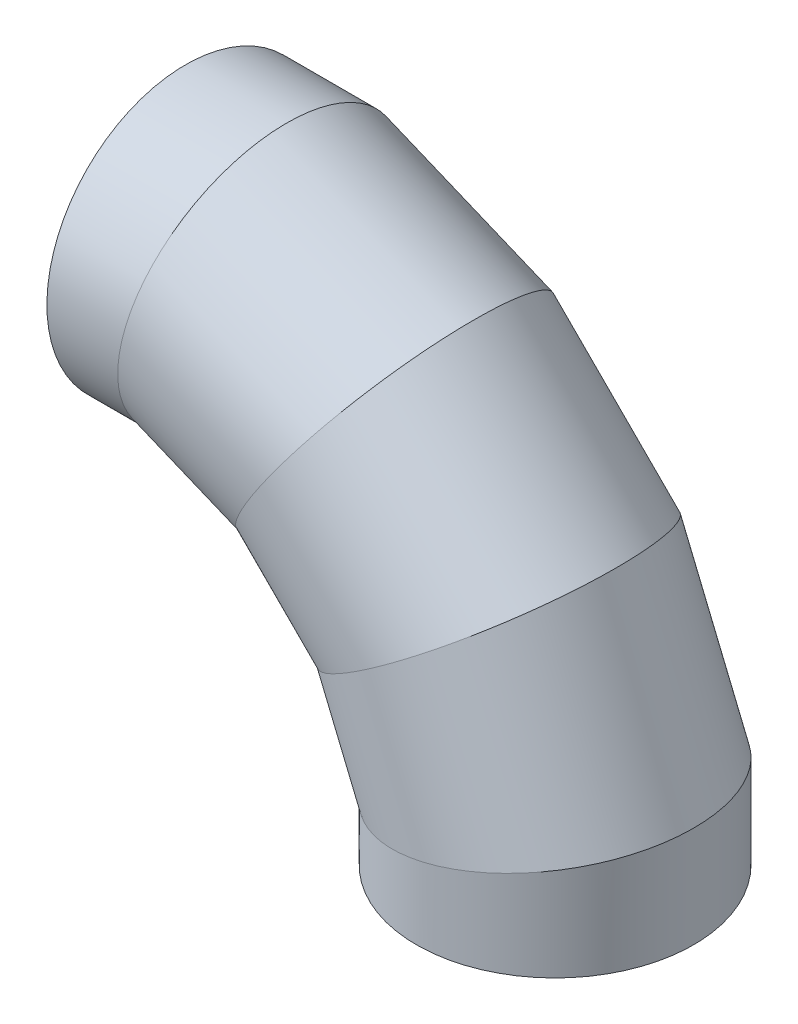
ISO-10303-21;
HEADER;
FILE_DESCRIPTION(('STEP AP214'),'2;1');
FILE_NAME('part.step','',(''),(''),'','','');
FILE_SCHEMA(('AUTOMOTIVE_DESIGN { 1 0 10303 214 1 1 1 1 }'));
ENDSEC;
DATA;
#1=APPLICATION_CONTEXT('core data for automotive mechanical design processes');
#2=APPLICATION_PROTOCOL_DEFINITION('international standard','automotive_design',2000,#1);
#3=PRODUCT_CONTEXT('',#1,'mechanical');
#4=PRODUCT('Part','Part','',(#3));
#5=PRODUCT_RELATED_PRODUCT_CATEGORY('part','',(#4));
#6=PRODUCT_DEFINITION_FORMATION('','',#4);
#7=PRODUCT_DEFINITION_CONTEXT('part definition',#1,'design');
#8=PRODUCT_DEFINITION('design','',#6,#7);
#9=PRODUCT_DEFINITION_SHAPE('','',#8);
#10=(LENGTH_UNIT() NAMED_UNIT(*) SI_UNIT(.MILLI.,.METRE.));
#11=(NAMED_UNIT(*) PLANE_ANGLE_UNIT() SI_UNIT($,.RADIAN.));
#12=(NAMED_UNIT(*) SI_UNIT($,.STERADIAN.) SOLID_ANGLE_UNIT());
#13=UNCERTAINTY_MEASURE_WITH_UNIT(LENGTH_MEASURE(1.E-05),#10,'distance_accuracy_value','');
#14=(GEOMETRIC_REPRESENTATION_CONTEXT(3) GLOBAL_UNCERTAINTY_ASSIGNED_CONTEXT((#13)) GLOBAL_UNIT_ASSIGNED_CONTEXT((#10,
#11,#12)) REPRESENTATION_CONTEXT('',''));
#15=CARTESIAN_POINT('',(0.,0.,0.));
#16=DIRECTION('',(0.,0.,1.));
#17=DIRECTION('',(1.,0.,0.));
#18=AXIS2_PLACEMENT_3D('',#15,#16,#17);
#19=CARTESIAN_POINT('',(280.14424979064,419.265498614272,-375.01));
#20=DIRECTION('',(0.831469612302545,-0.555570233019602,0.));
#21=DIRECTION('',(0.555570233019602,0.831469612302545,0.));
#22=AXIS2_PLACEMENT_3D('',#19,#20,#21);
#23=PLANE('',#22);
#24=CARTESIAN_POINT('',(566.454497350522,847.759065022574,0.));
#25=DIRECTION('',(0.831469612302545,-0.555570233019602,0.));
#26=DIRECTION('',(0.555570233019602,0.831469612302545,0.));
#27=AXIS2_PLACEMENT_3D('',#24,#25,#26);
#28=ELLIPSE('',#27,382.34668432812,375.);
#29=CARTESIAN_POINT('',(354.035760214366,529.851958926477,-1.5));
#30=VERTEX_POINT('',#29);
#31=CARTESIAN_POINT('',(354.035760214366,529.851958926477,1.5));
#32=VERTEX_POINT('',#31);
#33=EDGE_CURVE('E137',#30,#32,#28,.T.);
#34=ORIENTED_EDGE('',*,*,#33,.F.);
#35=DIRECTION('',(0.555570233019602,0.831469612302545,0.));
#36=VECTOR('',#35,1.);
#37=CARTESIAN_POINT('',(0.,0.,-1.5));
#38=LINE('',#37,#36);
#39=CARTESIAN_POINT('',(358.567433236969,536.634086886623,-1.5));
#40=VERTEX_POINT('',#39);
#41=EDGE_CURVE('E103',#30,#40,#38,.T.);
#42=ORIENTED_EDGE('',*,*,#41,.T.);
#43=CARTESIAN_POINT('',(566.454497350521,847.759065022575,0.));
#44=DIRECTION('',(0.831469612302545,-0.555570233019602,0.));
#45=DIRECTION('',(-0.555570233019602,-0.831469612302545,0.));
#46=AXIS2_PLACEMENT_3D('',#43,#44,#45);
#47=ELLIPSE('',#46,374.189955062453,367.);
#48=CARTESIAN_POINT('',(358.567433236969,536.634086886623,1.5));
#49=VERTEX_POINT('',#48);
#50=EDGE_CURVE('E102',#40,#49,#47,.T.);
#51=ORIENTED_EDGE('',*,*,#50,.T.);
#52=DIRECTION('',(0.555570233019602,0.831469612302545,0.));
#53=VECTOR('',#52,1.);
#54=CARTESIAN_POINT('',(0.,0.,1.5));
#55=LINE('',#54,#53);
#56=EDGE_CURVE('E78',#32,#49,#55,.T.);
#57=ORIENTED_EDGE('',*,*,#56,.F.);
#58=EDGE_LOOP('',(#34,#42,#51,#57));
#59=FACE_BOUND('',#58,.T.);
#60=ADVANCED_FACE('F53',(#59),#23,.F.);
#61=CARTESIAN_POINT('',(419.265498614272,280.14424979064,-375.01));
#62=DIRECTION('',(0.555570233019602,-0.831469612302545,0.));
#63=DIRECTION('',(0.831469612302545,0.555570233019602,0.));
#64=AXIS2_PLACEMENT_3D('',#61,#62,#63);
#65=PLANE('',#64);
#66=CARTESIAN_POINT('',(847.759065022574,566.454497350522,0.));
#67=DIRECTION('',(0.555570233019602,-0.831469612302546,0.));
#68=DIRECTION('',(0.831469612302546,0.555570233019602,0.));
#69=AXIS2_PLACEMENT_3D('',#66,#67,#68);
#70=ELLIPSE('',#69,382.346684328119,375.);
#71=CARTESIAN_POINT('',(529.851958926477,354.035760214366,-1.5));
#72=VERTEX_POINT('',#71);
#73=CARTESIAN_POINT('',(529.851958926477,354.035760214366,1.5));
#74=VERTEX_POINT('',#73);
#75=EDGE_CURVE('E57',#72,#74,#70,.T.);
#76=ORIENTED_EDGE('',*,*,#75,.T.);
#77=DIRECTION('',(0.831469612302545,0.555570233019602,0.));
#78=VECTOR('',#77,1.);
#79=CARTESIAN_POINT('',(0.,0.,1.5));
#80=LINE('',#79,#78);
#81=CARTESIAN_POINT('',(536.634086886622,358.56743323697,1.5));
#82=VERTEX_POINT('',#81);
#83=EDGE_CURVE('E99',#74,#82,#80,.T.);
#84=ORIENTED_EDGE('',*,*,#83,.T.);
#85=CARTESIAN_POINT('',(847.759065022573,566.454497350522,0.));
#86=DIRECTION('',(0.555570233019602,-0.831469612302545,0.));
#87=DIRECTION('',(-0.831469612302545,-0.555570233019602,0.));
#88=AXIS2_PLACEMENT_3D('',#85,#86,#87);
#89=ELLIPSE('',#88,374.189955062453,367.);
#90=CARTESIAN_POINT('',(536.634086886622,358.56743323697,-1.5));
#91=VERTEX_POINT('',#90);
#92=EDGE_CURVE('E70',#91,#82,#89,.T.);
#93=ORIENTED_EDGE('',*,*,#92,.F.);
#94=DIRECTION('',(0.831469612302545,0.555570233019602,0.));
#95=VECTOR('',#94,1.);
#96=CARTESIAN_POINT('',(0.,0.,-1.5));
#97=LINE('',#96,#95);
#98=EDGE_CURVE('E98',#72,#91,#97,.T.);
#99=ORIENTED_EDGE('',*,*,#98,.F.);
#100=EDGE_LOOP('',(#76,#84,#93,#99));
#101=FACE_BOUND('',#100,.T.);
#102=ADVANCED_FACE('F109',(#101),#65,.T.);
#103=CARTESIAN_POINT('',(450.345652507681,963.867909865415,0.));
#104=DIRECTION('',(0.707106781186547,-0.707106781186548,0.));
#105=DIRECTION('',(0.707106781186548,0.707106781186547,0.));
#106=AXIS2_PLACEMENT_3D('',#103,#104,#105);
#107=CYLINDRICAL_SURFACE('',#106,367.);
#108=ORIENTED_EDGE('',*,*,#50,.F.);
#109=DIRECTION('',(0.707106781186547,-0.707106781186548,0.));
#110=VECTOR('',#109,1.);
#111=CARTESIAN_POINT('',(190.839631382929,704.361888740663,-1.5));
#112=LINE('',#111,#110);
#113=EDGE_CURVE('E134',#40,#91,#112,.T.);
#114=ORIENTED_EDGE('',*,*,#113,.T.);
#115=ORIENTED_EDGE('',*,*,#92,.T.);
#116=DIRECTION('',(0.707106781186547,-0.707106781186548,0.));
#117=VECTOR('',#116,1.);
#118=CARTESIAN_POINT('',(190.839631382929,704.361888740663,1.5));
#119=LINE('',#118,#117);
#120=EDGE_CURVE('E12',#49,#82,#119,.T.);
#121=ORIENTED_EDGE('',*,*,#120,.F.);
#122=EDGE_LOOP('',(#108,#114,#115,#121));
#123=FACE_BOUND('',#122,.T.);
#124=ADVANCED_FACE('F106',(#123),#107,.F.);
#125=CARTESIAN_POINT('',(450.345652507681,963.867909865415,0.));
#126=DIRECTION('',(0.707106781186547,-0.707106781186548,0.));
#127=DIRECTION('',(0.707106781186548,0.707106781186547,0.));
#128=AXIS2_PLACEMENT_3D('',#125,#126,#127);
#129=CYLINDRICAL_SURFACE('',#128,375.);
#130=DIRECTION('',(0.707106781186547,-0.707106781186548,0.));
#131=VECTOR('',#130,1.);
#132=CARTESIAN_POINT('',(185.182730891555,698.704988249288,-1.5));
#133=LINE('',#132,#131);
#134=EDGE_CURVE('E131',#30,#72,#133,.T.);
#135=ORIENTED_EDGE('',*,*,#134,.F.);
#136=ORIENTED_EDGE('',*,*,#33,.T.);
#137=DIRECTION('',(0.707106781186547,-0.707106781186548,0.));
#138=VECTOR('',#137,1.);
#139=CARTESIAN_POINT('',(185.182730891555,698.704988249288,1.5));
#140=LINE('',#139,#138);
#141=EDGE_CURVE('E62',#32,#74,#140,.T.);
#142=ORIENTED_EDGE('',*,*,#141,.T.);
#143=ORIENTED_EDGE('',*,*,#75,.F.);
#144=EDGE_LOOP('',(#135,#136,#142,#143));
#145=FACE_BOUND('',#144,.T.);
#146=ADVANCED_FACE('F108',(#145),#129,.T.);
#147=CARTESIAN_POINT('',(0.,0.,-1.5));
#148=DIRECTION('',(0.,0.,1.));
#149=DIRECTION('',(1.,0.,0.));
#150=AXIS2_PLACEMENT_3D('',#147,#148,#149);
#151=PLANE('',#150);
#152=ORIENTED_EDGE('',*,*,#134,.T.);
#153=ORIENTED_EDGE('',*,*,#98,.T.);
#154=ORIENTED_EDGE('',*,*,#113,.F.);
#155=ORIENTED_EDGE('',*,*,#41,.F.);
#156=EDGE_LOOP('',(#152,#153,#154,#155));
#157=FACE_BOUND('',#156,.T.);
#158=ADVANCED_FACE('F115',(#157),#151,.T.);
#159=CARTESIAN_POINT('',(0.,0.,1.5));
#160=DIRECTION('',(0.,0.,1.));
#161=DIRECTION('',(1.,0.,0.));
#162=AXIS2_PLACEMENT_3D('',#159,#160,#161);
#163=PLANE('',#162);
#164=ORIENTED_EDGE('',*,*,#83,.F.);
#165=ORIENTED_EDGE('',*,*,#141,.F.);
#166=ORIENTED_EDGE('',*,*,#56,.T.);
#167=ORIENTED_EDGE('',*,*,#120,.T.);
#168=EDGE_LOOP('',(#164,#165,#166,#167));
#169=FACE_BOUND('',#168,.T.);
#170=ADVANCED_FACE('F55',(#169),#163,.F.);
#171=CLOSED_SHELL('',(#60,#102,#124,#146,#158,#170));
#172=MANIFOLD_SOLID_BREP('B2',#171);
#173=CARTESIAN_POINT('',(98.3735784503311,494.55737592509,-375.01));
#174=DIRECTION('',(0.98078528040323,-0.195090322016128,0.));
#175=DIRECTION('',(0.195090322016128,0.980785280403231,0.));
#176=AXIS2_PLACEMENT_3D('',#173,#174,#175);
#177=PLANE('',#176);
#178=CARTESIAN_POINT('',(198.912367379658,1000.,0.));
#179=DIRECTION('',(0.98078528040323,-0.195090322016128,0.));
#180=DIRECTION('',(0.195090322016128,0.980785280403231,0.));
#181=AXIS2_PLACEMENT_3D('',#178,#179,#180);
#182=ELLIPSE('',#181,382.346684328119,375.);
#183=CARTESIAN_POINT('',(124.320826351775,625.003000012,-1.5));
#184=VERTEX_POINT('',#183);
#185=CARTESIAN_POINT('',(124.320826351775,625.003000012,1.5));
#186=VERTEX_POINT('',#185);
#187=EDGE_CURVE('E198',#184,#186,#182,.T.);
#188=ORIENTED_EDGE('',*,*,#187,.T.);
#189=DIRECTION('',(0.195090322016128,0.980785280403231,0.));
#190=VECTOR('',#189,1.);
#191=CARTESIAN_POINT('',(0.,0.,1.5));
#192=LINE('',#191,#190);
#193=CARTESIAN_POINT('',(125.912138298865,633.003065407898,1.5));
#194=VERTEX_POINT('',#193);
#195=EDGE_CURVE('E244',#186,#194,#192,.T.);
#196=ORIENTED_EDGE('',*,*,#195,.T.);
#197=CARTESIAN_POINT('',(198.912367379658,1000.,0.));
#198=DIRECTION('',(0.980785280403231,-0.195090322016128,0.));
#199=DIRECTION('',(-0.195090322016128,-0.98078528040323,0.));
#200=AXIS2_PLACEMENT_3D('',#197,#198,#199);
#201=ELLIPSE('',#200,374.189955062453,367.);
#202=CARTESIAN_POINT('',(125.912138298865,633.003065407898,-1.5));
#203=VERTEX_POINT('',#202);
#204=EDGE_CURVE('E211',#203,#194,#201,.T.);
#205=ORIENTED_EDGE('',*,*,#204,.F.);
#206=DIRECTION('',(0.195090322016128,0.980785280403231,0.));
#207=VECTOR('',#206,1.);
#208=CARTESIAN_POINT('',(0.,0.,-1.5));
#209=LINE('',#208,#207);
#210=EDGE_CURVE('E248',#184,#203,#209,.T.);
#211=ORIENTED_EDGE('',*,*,#210,.F.);
#212=EDGE_LOOP('',(#188,#196,#205,#211));
#213=FACE_BOUND('',#212,.T.);
#214=ADVANCED_FACE('F194',(#213),#177,.T.);
#215=CARTESIAN_POINT('',(1.66533453693773E-13,1000.,0.));
#216=DIRECTION('',(-1.,0.,0.));
#217=DIRECTION('',(0.,0.,1.));
#218=AXIS2_PLACEMENT_3D('',#215,#216,#217);
#219=PLANE('',#218);
#220=CARTESIAN_POINT('',(1.66533453693773E-13,1000.,0.));
#221=DIRECTION('',(-1.,0.,0.));
#222=DIRECTION('',(0.,0.,1.));
#223=AXIS2_PLACEMENT_3D('',#220,#221,#222);
#224=CIRCLE('',#223,375.);
#225=CARTESIAN_POINT('',(1.04083908160968E-13,625.003000012,1.5));
#226=VERTEX_POINT('',#225);
#227=CARTESIAN_POINT('',(1.04083908160968E-13,625.003000012,-1.5));
#228=VERTEX_POINT('',#227);
#229=EDGE_CURVE('E240',#226,#228,#224,.T.);
#230=ORIENTED_EDGE('',*,*,#229,.T.);
#231=DIRECTION('',(0.,1.,0.));
#232=VECTOR('',#231,1.);
#233=CARTESIAN_POINT('',(1.66533453693773E-13,1000.,-1.5));
#234=LINE('',#233,#232);
#235=CARTESIAN_POINT('',(1.05415678888076E-13,633.003065407898,-1.5));
#236=VERTEX_POINT('',#235);
#237=EDGE_CURVE('E241',#228,#236,#234,.T.);
#238=ORIENTED_EDGE('',*,*,#237,.T.);
#239=CARTESIAN_POINT('',(1.66533453693773E-13,1000.,0.));
#240=DIRECTION('',(-1.,0.,0.));
#241=DIRECTION('',(0.,-1.,0.));
#242=AXIS2_PLACEMENT_3D('',#239,#240,#241);
#243=CIRCLE('',#242,367.);
#244=CARTESIAN_POINT('',(1.05416186681123E-13,633.003065407898,1.5));
#245=VERTEX_POINT('',#244);
#246=EDGE_CURVE('E256',#245,#236,#243,.T.);
#247=ORIENTED_EDGE('',*,*,#246,.F.);
#248=DIRECTION('',(0.,1.,0.));
#249=VECTOR('',#248,1.);
#250=CARTESIAN_POINT('',(1.66533453693773E-13,1000.,1.5));
#251=LINE('',#250,#249);
#252=EDGE_CURVE('E51',#226,#245,#251,.T.);
#253=ORIENTED_EDGE('',*,*,#252,.F.);
#254=EDGE_LOOP('',(#230,#238,#247,#253));
#255=FACE_BOUND('',#254,.T.);
#256=ADVANCED_FACE('F266',(#255),#219,.T.);
#257=CARTESIAN_POINT('',(1.66533453693773E-13,1000.,0.));
#258=DIRECTION('',(1.,0.,0.));
#259=DIRECTION('',(0.,0.,-1.));
#260=AXIS2_PLACEMENT_3D('',#257,#258,#259);
#261=CYLINDRICAL_SURFACE('',#260,367.);
#262=ORIENTED_EDGE('',*,*,#246,.T.);
#263=DIRECTION('',(1.,0.,0.));
#264=VECTOR('',#263,1.);
#265=CARTESIAN_POINT('',(1.66533453693773E-13,633.003065407898,-1.5));
#266=LINE('',#265,#264);
#267=EDGE_CURVE('E252',#236,#203,#266,.T.);
#268=ORIENTED_EDGE('',*,*,#267,.T.);
#269=ORIENTED_EDGE('',*,*,#204,.T.);
#270=DIRECTION('',(1.,0.,0.));
#271=VECTOR('',#270,1.);
#272=CARTESIAN_POINT('',(1.66533453693773E-13,633.003065407898,1.5));
#273=LINE('',#272,#271);
#274=EDGE_CURVE('E246',#245,#194,#273,.T.);
#275=ORIENTED_EDGE('',*,*,#274,.F.);
#276=EDGE_LOOP('',(#262,#268,#269,#275));
#277=FACE_BOUND('',#276,.T.);
#278=ADVANCED_FACE('F268',(#277),#261,.F.);
#279=CARTESIAN_POINT('',(1.66533453693773E-13,1000.,0.));
#280=DIRECTION('',(1.,0.,0.));
#281=DIRECTION('',(0.,0.,-1.));
#282=AXIS2_PLACEMENT_3D('',#279,#280,#281);
#283=CYLINDRICAL_SURFACE('',#282,375.);
#284=DIRECTION('',(1.,0.,0.));
#285=VECTOR('',#284,1.);
#286=CARTESIAN_POINT('',(1.66533453693773E-13,625.003000012,-1.5));
#287=LINE('',#286,#285);
#288=EDGE_CURVE('E260',#228,#184,#287,.T.);
#289=ORIENTED_EDGE('',*,*,#288,.F.);
#290=ORIENTED_EDGE('',*,*,#229,.F.);
#291=DIRECTION('',(1.,0.,0.));
#292=VECTOR('',#291,1.);
#293=CARTESIAN_POINT('',(1.66533453693773E-13,625.003000012,1.5));
#294=LINE('',#293,#292);
#295=EDGE_CURVE('E203',#226,#186,#294,.T.);
#296=ORIENTED_EDGE('',*,*,#295,.T.);
#297=ORIENTED_EDGE('',*,*,#187,.F.);
#298=EDGE_LOOP('',(#289,#290,#296,#297));
#299=FACE_BOUND('',#298,.T.);
#300=ADVANCED_FACE('F237',(#299),#283,.T.);
#301=CARTESIAN_POINT('',(0.,0.,-1.5));
#302=DIRECTION('',(0.,0.,1.));
#303=DIRECTION('',(1.,0.,0.));
#304=AXIS2_PLACEMENT_3D('',#301,#302,#303);
#305=PLANE('',#304);
#306=ORIENTED_EDGE('',*,*,#288,.T.);
#307=ORIENTED_EDGE('',*,*,#210,.T.);
#308=ORIENTED_EDGE('',*,*,#267,.F.);
#309=ORIENTED_EDGE('',*,*,#237,.F.);
#310=EDGE_LOOP('',(#306,#307,#308,#309));
#311=FACE_BOUND('',#310,.T.);
#312=ADVANCED_FACE('F196',(#311),#305,.T.);
#313=CARTESIAN_POINT('',(0.,0.,1.5));
#314=DIRECTION('',(0.,0.,1.));
#315=DIRECTION('',(1.,0.,0.));
#316=AXIS2_PLACEMENT_3D('',#313,#314,#315);
#317=PLANE('',#316);
#318=ORIENTED_EDGE('',*,*,#195,.F.);
#319=ORIENTED_EDGE('',*,*,#295,.F.);
#320=ORIENTED_EDGE('',*,*,#252,.T.);
#321=ORIENTED_EDGE('',*,*,#274,.T.);
#322=EDGE_LOOP('',(#318,#319,#320,#321));
#323=FACE_BOUND('',#322,.T.);
#324=ADVANCED_FACE('F245',(#323),#317,.F.);
#325=CLOSED_SHELL('',(#214,#256,#278,#300,#312,#324));
#326=MANIFOLD_SOLID_BREP('B6',#325);
#327=CARTESIAN_POINT('',(419.265498614272,280.14424979064,-375.01));
#328=DIRECTION('',(0.555570233019602,-0.831469612302545,0.));
#329=DIRECTION('',(0.831469612302545,0.555570233019602,0.));
#330=AXIS2_PLACEMENT_3D('',#327,#328,#329);
#331=PLANE('',#330);
#332=CARTESIAN_POINT('',(847.759065022574,566.454497350522,0.));
#333=DIRECTION('',(0.555570233019602,-0.831469612302546,0.));
#334=DIRECTION('',(0.831469612302546,0.555570233019602,0.));
#335=AXIS2_PLACEMENT_3D('',#332,#333,#334);
#336=ELLIPSE('',#335,382.346684328119,375.);
#337=CARTESIAN_POINT('',(529.851958926477,354.035760214366,-1.5));
#338=VERTEX_POINT('',#337);
#339=CARTESIAN_POINT('',(529.851958926477,354.035760214366,1.5));
#340=VERTEX_POINT('',#339);
#341=EDGE_CURVE('E421',#338,#340,#336,.T.);
#342=ORIENTED_EDGE('',*,*,#341,.F.);
#343=DIRECTION('',(0.831469612302545,0.555570233019602,0.));
#344=VECTOR('',#343,1.);
#345=CARTESIAN_POINT('',(0.,0.,-1.5));
#346=LINE('',#345,#344);
#347=CARTESIAN_POINT('',(536.634086886622,358.56743323697,-1.5));
#348=VERTEX_POINT('',#347);
#349=EDGE_CURVE('E387',#338,#348,#346,.T.);
#350=ORIENTED_EDGE('',*,*,#349,.T.);
#351=CARTESIAN_POINT('',(847.759065022573,566.454497350522,0.));
#352=DIRECTION('',(0.555570233019602,-0.831469612302545,0.));
#353=DIRECTION('',(-0.831469612302545,-0.555570233019602,0.));
#354=AXIS2_PLACEMENT_3D('',#351,#352,#353);
#355=ELLIPSE('',#354,374.189955062453,367.);
#356=CARTESIAN_POINT('',(536.634086886622,358.56743323697,1.5));
#357=VERTEX_POINT('',#356);
#358=EDGE_CURVE('E386',#348,#357,#355,.T.);
#359=ORIENTED_EDGE('',*,*,#358,.T.);
#360=DIRECTION('',(0.831469612302545,0.555570233019602,0.));
#361=VECTOR('',#360,1.);
#362=CARTESIAN_POINT('',(0.,0.,1.5));
#363=LINE('',#362,#361);
#364=EDGE_CURVE('E362',#340,#357,#363,.T.);
#365=ORIENTED_EDGE('',*,*,#364,.F.);
#366=EDGE_LOOP('',(#342,#350,#359,#365));
#367=FACE_BOUND('',#366,.T.);
#368=ADVANCED_FACE('F337',(#367),#331,.F.);
#369=CARTESIAN_POINT('',(494.55737592509,98.3735784503312,-375.01));
#370=DIRECTION('',(0.195090322016128,-0.98078528040323,0.));
#371=DIRECTION('',(0.98078528040323,0.195090322016128,0.));
#372=AXIS2_PLACEMENT_3D('',#369,#370,#371);
#373=PLANE('',#372);
#374=CARTESIAN_POINT('',(1000.,198.912367379658,0.));
#375=DIRECTION('',(0.195090322016128,-0.98078528040323,0.));
#376=DIRECTION('',(0.980785280403231,0.195090322016128,0.));
#377=AXIS2_PLACEMENT_3D('',#374,#375,#376);
#378=ELLIPSE('',#377,382.346684328119,375.);
#379=CARTESIAN_POINT('',(625.003000012,124.320826351775,-1.5));
#380=VERTEX_POINT('',#379);
#381=CARTESIAN_POINT('',(625.003000012,124.320826351775,1.5));
#382=VERTEX_POINT('',#381);
#383=EDGE_CURVE('E341',#380,#382,#378,.T.);
#384=ORIENTED_EDGE('',*,*,#383,.T.);
#385=DIRECTION('',(0.98078528040323,0.195090322016128,0.));
#386=VECTOR('',#385,1.);
#387=CARTESIAN_POINT('',(0.,0.,1.5));
#388=LINE('',#387,#386);
#389=CARTESIAN_POINT('',(633.003065407897,125.912138298865,1.5));
#390=VERTEX_POINT('',#389);
#391=EDGE_CURVE('E383',#382,#390,#388,.T.);
#392=ORIENTED_EDGE('',*,*,#391,.T.);
#393=CARTESIAN_POINT('',(1000.,198.912367379658,0.));
#394=DIRECTION('',(0.195090322016128,-0.98078528040323,0.));
#395=DIRECTION('',(-0.980785280403231,-0.195090322016128,0.));
#396=AXIS2_PLACEMENT_3D('',#393,#394,#395);
#397=ELLIPSE('',#396,374.189955062453,367.);
#398=CARTESIAN_POINT('',(633.003065407897,125.912138298865,-1.5));
#399=VERTEX_POINT('',#398);
#400=EDGE_CURVE('E354',#399,#390,#397,.T.);
#401=ORIENTED_EDGE('',*,*,#400,.F.);
#402=DIRECTION('',(0.98078528040323,0.195090322016128,0.));
#403=VECTOR('',#402,1.);
#404=CARTESIAN_POINT('',(0.,0.,-1.5));
#405=LINE('',#404,#403);
#406=EDGE_CURVE('E382',#380,#399,#405,.T.);
#407=ORIENTED_EDGE('',*,*,#406,.F.);
#408=EDGE_LOOP('',(#384,#392,#401,#407));
#409=FACE_BOUND('',#408,.T.);
#410=ADVANCED_FACE('F393',(#409),#373,.T.);
#411=CARTESIAN_POINT('',(784.921411001149,718.158013916754,0.));
#412=DIRECTION('',(0.38268343236509,-0.923879532511287,0.));
#413=DIRECTION('',(0.923879532511287,0.38268343236509,0.));
#414=AXIS2_PLACEMENT_3D('',#411,#412,#413);
#415=CYLINDRICAL_SURFACE('',#414,367.);
#416=ORIENTED_EDGE('',*,*,#358,.F.);
#417=DIRECTION('',(0.38268343236509,-0.923879532511287,0.));
#418=VECTOR('',#417,1.);
#419=CARTESIAN_POINT('',(445.860454637122,577.714367319582,-1.5));
#420=LINE('',#419,#418);
#421=EDGE_CURVE('E418',#348,#399,#420,.T.);
#422=ORIENTED_EDGE('',*,*,#421,.T.);
#423=ORIENTED_EDGE('',*,*,#400,.T.);
#424=DIRECTION('',(0.38268343236509,-0.923879532511287,0.));
#425=VECTOR('',#424,1.);
#426=CARTESIAN_POINT('',(445.860454637122,577.714367319582,1.5));
#427=LINE('',#426,#425);
#428=EDGE_CURVE('E192',#357,#390,#427,.T.);
#429=ORIENTED_EDGE('',*,*,#428,.F.);
#430=EDGE_LOOP('',(#416,#422,#423,#429));
#431=FACE_BOUND('',#430,.T.);
#432=ADVANCED_FACE('F390',(#431),#415,.F.);
#433=CARTESIAN_POINT('',(784.921411001149,718.158013916754,0.));
#434=DIRECTION('',(0.38268343236509,-0.923879532511287,0.));
#435=DIRECTION('',(0.923879532511287,0.38268343236509,0.));
#436=AXIS2_PLACEMENT_3D('',#433,#434,#435);
#437=CYLINDRICAL_SURFACE('',#436,375.);
#438=DIRECTION('',(0.38268343236509,-0.923879532511287,0.));
#439=VECTOR('',#438,1.);
#440=CARTESIAN_POINT('',(438.4693579591,574.652874834735,-1.5));
#441=LINE('',#440,#439);
#442=EDGE_CURVE('E415',#338,#380,#441,.T.);
#443=ORIENTED_EDGE('',*,*,#442,.F.);
#444=ORIENTED_EDGE('',*,*,#341,.T.);
#445=DIRECTION('',(0.38268343236509,-0.923879532511287,0.));
#446=VECTOR('',#445,1.);
#447=CARTESIAN_POINT('',(438.4693579591,574.652874834735,1.5));
#448=LINE('',#447,#446);
#449=EDGE_CURVE('E346',#340,#382,#448,.T.);
#450=ORIENTED_EDGE('',*,*,#449,.T.);
#451=ORIENTED_EDGE('',*,*,#383,.F.);
#452=EDGE_LOOP('',(#443,#444,#450,#451));
#453=FACE_BOUND('',#452,.T.);
#454=ADVANCED_FACE('F392',(#453),#437,.T.);
#455=CARTESIAN_POINT('',(0.,0.,-1.5));
#456=DIRECTION('',(0.,0.,1.));
#457=DIRECTION('',(1.,0.,0.));
#458=AXIS2_PLACEMENT_3D('',#455,#456,#457);
#459=PLANE('',#458);
#460=ORIENTED_EDGE('',*,*,#442,.T.);
#461=ORIENTED_EDGE('',*,*,#406,.T.);
#462=ORIENTED_EDGE('',*,*,#421,.F.);
#463=ORIENTED_EDGE('',*,*,#349,.F.);
#464=EDGE_LOOP('',(#460,#461,#462,#463));
#465=FACE_BOUND('',#464,.T.);
#466=ADVANCED_FACE('F399',(#465),#459,.T.);
#467=CARTESIAN_POINT('',(0.,0.,1.5));
#468=DIRECTION('',(0.,0.,1.));
#469=DIRECTION('',(1.,0.,0.));
#470=AXIS2_PLACEMENT_3D('',#467,#468,#469);
#471=PLANE('',#470);
#472=ORIENTED_EDGE('',*,*,#391,.F.);
#473=ORIENTED_EDGE('',*,*,#449,.F.);
#474=ORIENTED_EDGE('',*,*,#364,.T.);
#475=ORIENTED_EDGE('',*,*,#428,.T.);
#476=EDGE_LOOP('',(#472,#473,#474,#475));
#477=FACE_BOUND('',#476,.T.);
#478=ADVANCED_FACE('F339',(#477),#471,.F.);
#479=CLOSED_SHELL('',(#368,#410,#432,#454,#466,#478));
#480=MANIFOLD_SOLID_BREP('B45',#479);
#481=CARTESIAN_POINT('',(98.3735784503311,494.55737592509,-375.01));
#482=DIRECTION('',(0.98078528040323,-0.195090322016128,0.));
#483=DIRECTION('',(0.195090322016128,0.980785280403231,0.));
#484=AXIS2_PLACEMENT_3D('',#481,#482,#483);
#485=PLANE('',#484);
#486=CARTESIAN_POINT('',(198.912367379658,1000.,0.));
#487=DIRECTION('',(0.98078528040323,-0.195090322016128,0.));
#488=DIRECTION('',(0.195090322016128,0.980785280403231,0.));
#489=AXIS2_PLACEMENT_3D('',#486,#487,#488);
#490=ELLIPSE('',#489,382.346684328119,375.);
#491=CARTESIAN_POINT('',(124.320826351775,625.003000012,-1.5));
#492=VERTEX_POINT('',#491);
#493=CARTESIAN_POINT('',(124.320826351775,625.003000012,1.5));
#494=VERTEX_POINT('',#493);
#495=EDGE_CURVE('E531',#492,#494,#490,.T.);
#496=ORIENTED_EDGE('',*,*,#495,.F.);
#497=DIRECTION('',(0.195090322016128,0.980785280403231,0.));
#498=VECTOR('',#497,1.);
#499=CARTESIAN_POINT('',(0.,0.,-1.5));
#500=LINE('',#499,#498);
#501=CARTESIAN_POINT('',(125.912138298865,633.003065407898,-1.5));
#502=VERTEX_POINT('',#501);
#503=EDGE_CURVE('E537',#492,#502,#500,.T.);
#504=ORIENTED_EDGE('',*,*,#503,.T.);
#505=CARTESIAN_POINT('',(198.912367379658,1000.,0.));
#506=DIRECTION('',(0.980785280403231,-0.195090322016128,0.));
#507=DIRECTION('',(-0.195090322016128,-0.98078528040323,0.));
#508=AXIS2_PLACEMENT_3D('',#505,#506,#507);
#509=ELLIPSE('',#508,374.189955062453,367.);
#510=CARTESIAN_POINT('',(125.912138298865,633.003065407898,1.5));
#511=VERTEX_POINT('',#510);
#512=EDGE_CURVE('E335',#502,#511,#509,.T.);
#513=ORIENTED_EDGE('',*,*,#512,.T.);
#514=DIRECTION('',(0.195090322016128,0.980785280403231,0.));
#515=VECTOR('',#514,1.);
#516=CARTESIAN_POINT('',(0.,0.,1.5));
#517=LINE('',#516,#515);
#518=EDGE_CURVE('E494',#494,#511,#517,.T.);
#519=ORIENTED_EDGE('',*,*,#518,.F.);
#520=EDGE_LOOP('',(#496,#504,#513,#519));
#521=FACE_BOUND('',#520,.T.);
#522=ADVANCED_FACE('F477',(#521),#485,.F.);
#523=CARTESIAN_POINT('',(280.14424979064,419.265498614272,-375.01));
#524=DIRECTION('',(0.831469612302545,-0.555570233019602,0.));
#525=DIRECTION('',(0.555570233019602,0.831469612302545,0.));
#526=AXIS2_PLACEMENT_3D('',#523,#524,#525);
#527=PLANE('',#526);
#528=CARTESIAN_POINT('',(566.454497350522,847.759065022574,0.));
#529=DIRECTION('',(0.831469612302545,-0.555570233019602,0.));
#530=DIRECTION('',(0.555570233019602,0.831469612302545,0.));
#531=AXIS2_PLACEMENT_3D('',#528,#529,#530);
#532=ELLIPSE('',#531,382.34668432812,375.);
#533=CARTESIAN_POINT('',(354.035760214366,529.851958926477,-1.5));
#534=VERTEX_POINT('',#533);
#535=CARTESIAN_POINT('',(354.035760214366,529.851958926477,1.5));
#536=VERTEX_POINT('',#535);
#537=EDGE_CURVE('E486',#534,#536,#532,.T.);
#538=ORIENTED_EDGE('',*,*,#537,.T.);
#539=DIRECTION('',(0.555570233019602,0.831469612302545,0.));
#540=VECTOR('',#539,1.);
#541=CARTESIAN_POINT('',(0.,0.,1.5));
#542=LINE('',#541,#540);
#543=CARTESIAN_POINT('',(358.567433236969,536.634086886623,1.5));
#544=VERTEX_POINT('',#543);
#545=EDGE_CURVE('E480',#536,#544,#542,.T.);
#546=ORIENTED_EDGE('',*,*,#545,.T.);
#547=CARTESIAN_POINT('',(566.454497350521,847.759065022575,0.));
#548=DIRECTION('',(0.831469612302545,-0.555570233019602,0.));
#549=DIRECTION('',(-0.555570233019602,-0.831469612302545,0.));
#550=AXIS2_PLACEMENT_3D('',#547,#548,#549);
#551=ELLIPSE('',#550,374.189955062453,367.);
#552=CARTESIAN_POINT('',(358.567433236969,536.634086886623,-1.5));
#553=VERTEX_POINT('',#552);
#554=EDGE_CURVE('E521',#553,#544,#551,.T.);
#555=ORIENTED_EDGE('',*,*,#554,.F.);
#556=DIRECTION('',(0.555570233019602,0.831469612302545,0.));
#557=VECTOR('',#556,1.);
#558=CARTESIAN_POINT('',(0.,0.,-1.5));
#559=LINE('',#558,#557);
#560=EDGE_CURVE('E550',#534,#553,#559,.T.);
#561=ORIENTED_EDGE('',*,*,#560,.F.);
#562=EDGE_LOOP('',(#538,#546,#555,#561));
#563=FACE_BOUND('',#562,.T.);
#564=ADVANCED_FACE('F535',(#563),#527,.T.);
#565=CARTESIAN_POINT('',(47.2088508134255,1062.83765402143,0.));
#566=DIRECTION('',(0.923879532511287,-0.382683432365089,0.));
#567=DIRECTION('',(0.382683432365089,0.923879532511287,0.));
#568=AXIS2_PLACEMENT_3D('',#565,#566,#567);
#569=CYLINDRICAL_SURFACE('',#568,367.);
#570=ORIENTED_EDGE('',*,*,#512,.F.);
#571=DIRECTION('',(0.923879532511287,-0.382683432365089,0.));
#572=VECTOR('',#571,1.);
#573=CARTESIAN_POINT('',(-93.2347957837463,723.776697657398,-1.5));
#574=LINE('',#573,#572);
#575=EDGE_CURVE('E526',#502,#553,#574,.T.);
#576=ORIENTED_EDGE('',*,*,#575,.T.);
#577=ORIENTED_EDGE('',*,*,#554,.T.);
#578=DIRECTION('',(0.923879532511287,-0.382683432365089,0.));
#579=VECTOR('',#578,1.);
#580=CARTESIAN_POINT('',(-93.2347957837463,723.776697657398,1.5));
#581=LINE('',#580,#579);
#582=EDGE_CURVE('E524',#511,#544,#581,.T.);
#583=ORIENTED_EDGE('',*,*,#582,.F.);
#584=EDGE_LOOP('',(#570,#576,#577,#583));
#585=FACE_BOUND('',#584,.T.);
#586=ADVANCED_FACE('F523',(#585),#569,.F.);
#587=CARTESIAN_POINT('',(47.2088508134255,1062.83765402143,0.));
#588=DIRECTION('',(0.923879532511287,-0.382683432365089,0.));
#589=DIRECTION('',(0.382683432365089,0.923879532511287,0.));
#590=AXIS2_PLACEMENT_3D('',#587,#588,#589);
#591=CYLINDRICAL_SURFACE('',#590,375.);
#592=DIRECTION('',(0.923879532511287,-0.382683432365089,0.));
#593=VECTOR('',#592,1.);
#594=CARTESIAN_POINT('',(-96.2962882685935,716.385600979377,-1.5));
#595=LINE('',#594,#593);
#596=EDGE_CURVE('E532',#492,#534,#595,.T.);
#597=ORIENTED_EDGE('',*,*,#596,.F.);
#598=ORIENTED_EDGE('',*,*,#495,.T.);
#599=DIRECTION('',(0.923879532511287,-0.382683432365089,0.));
#600=VECTOR('',#599,1.);
#601=CARTESIAN_POINT('',(-96.2962882685935,716.385600979377,1.5));
#602=LINE('',#601,#600);
#603=EDGE_CURVE('E500',#494,#536,#602,.T.);
#604=ORIENTED_EDGE('',*,*,#603,.T.);
#605=ORIENTED_EDGE('',*,*,#537,.F.);
#606=EDGE_LOOP('',(#597,#598,#604,#605));
#607=FACE_BOUND('',#606,.T.);
#608=ADVANCED_FACE('F561',(#607),#591,.T.);
#609=CARTESIAN_POINT('',(0.,0.,-1.5));
#610=DIRECTION('',(0.,0.,1.));
#611=DIRECTION('',(1.,0.,0.));
#612=AXIS2_PLACEMENT_3D('',#609,#610,#611);
#613=PLANE('',#612);
#614=ORIENTED_EDGE('',*,*,#596,.T.);
#615=ORIENTED_EDGE('',*,*,#560,.T.);
#616=ORIENTED_EDGE('',*,*,#575,.F.);
#617=ORIENTED_EDGE('',*,*,#503,.F.);
#618=EDGE_LOOP('',(#614,#615,#616,#617));
#619=FACE_BOUND('',#618,.T.);
#620=ADVANCED_FACE('F559',(#619),#613,.T.);
#621=CARTESIAN_POINT('',(0.,0.,1.5));
#622=DIRECTION('',(0.,0.,1.));
#623=DIRECTION('',(1.,0.,0.));
#624=AXIS2_PLACEMENT_3D('',#621,#622,#623);
#625=PLANE('',#624);
#626=ORIENTED_EDGE('',*,*,#545,.F.);
#627=ORIENTED_EDGE('',*,*,#603,.F.);
#628=ORIENTED_EDGE('',*,*,#518,.T.);
#629=ORIENTED_EDGE('',*,*,#582,.T.);
#630=EDGE_LOOP('',(#626,#627,#628,#629));
#631=FACE_BOUND('',#630,.T.);
#632=ADVANCED_FACE('F538',(#631),#625,.F.);
#633=CLOSED_SHELL('',(#522,#564,#586,#608,#620,#632));
#634=MANIFOLD_SOLID_BREP('B186',#633);
#635=CARTESIAN_POINT('',(494.55737592509,98.3735784503312,-375.01));
#636=DIRECTION('',(0.195090322016128,-0.98078528040323,0.));
#637=DIRECTION('',(0.98078528040323,0.195090322016128,0.));
#638=AXIS2_PLACEMENT_3D('',#635,#636,#637);
#639=PLANE('',#638);
#640=CARTESIAN_POINT('',(1000.,198.912367379658,0.));
#641=DIRECTION('',(0.195090322016128,-0.98078528040323,0.));
#642=DIRECTION('',(0.980785280403231,0.195090322016128,0.));
#643=AXIS2_PLACEMENT_3D('',#640,#641,#642);
#644=ELLIPSE('',#643,382.346684328119,375.);
#645=CARTESIAN_POINT('',(625.003000012,124.320826351775,-1.5));
#646=VERTEX_POINT('',#645);
#647=CARTESIAN_POINT('',(625.003000012,124.320826351775,1.5));
#648=VERTEX_POINT('',#647);
#649=EDGE_CURVE('E624',#646,#648,#644,.T.);
#650=ORIENTED_EDGE('',*,*,#649,.F.);
#651=DIRECTION('',(0.98078528040323,0.195090322016128,0.));
#652=VECTOR('',#651,1.);
#653=CARTESIAN_POINT('',(0.,0.,-1.5));
#654=LINE('',#653,#652);
#655=CARTESIAN_POINT('',(633.003065407897,125.912138298865,-1.5));
#656=VERTEX_POINT('',#655);
#657=EDGE_CURVE('E662',#646,#656,#654,.T.);
#658=ORIENTED_EDGE('',*,*,#657,.T.);
#659=CARTESIAN_POINT('',(1000.,198.912367379658,0.));
#660=DIRECTION('',(0.195090322016128,-0.98078528040323,0.));
#661=DIRECTION('',(-0.980785280403231,-0.195090322016128,0.));
#662=AXIS2_PLACEMENT_3D('',#659,#660,#661);
#663=ELLIPSE('',#662,374.189955062453,367.);
#664=CARTESIAN_POINT('',(633.003065407897,125.912138298865,1.5));
#665=VERTEX_POINT('',#664);
#666=EDGE_CURVE('E664',#656,#665,#663,.T.);
#667=ORIENTED_EDGE('',*,*,#666,.T.);
#668=DIRECTION('',(0.98078528040323,0.195090322016128,0.));
#669=VECTOR('',#668,1.);
#670=CARTESIAN_POINT('',(0.,0.,1.5));
#671=LINE('',#670,#669);
#672=EDGE_CURVE('E656',#648,#665,#671,.T.);
#673=ORIENTED_EDGE('',*,*,#672,.F.);
#674=EDGE_LOOP('',(#650,#658,#667,#673));
#675=FACE_BOUND('',#674,.T.);
#676=ADVANCED_FACE('F620',(#675),#639,.F.);
#677=CARTESIAN_POINT('',(1000.,0.,0.));
#678=DIRECTION('',(0.,1.,0.));
#679=DIRECTION('',(0.,0.,1.));
#680=AXIS2_PLACEMENT_3D('',#677,#678,#679);
#681=PLANE('',#680);
#682=DIRECTION('',(1.,0.,0.));
#683=VECTOR('',#682,1.);
#684=CARTESIAN_POINT('',(1000.,0.,-1.5));
#685=LINE('',#684,#683);
#686=CARTESIAN_POINT('',(625.003000012,0.,-1.5));
#687=VERTEX_POINT('',#686);
#688=CARTESIAN_POINT('',(633.003065407897,0.,-1.5));
#689=VERTEX_POINT('',#688);
#690=EDGE_CURVE('E679',#687,#689,#685,.T.);
#691=ORIENTED_EDGE('',*,*,#690,.F.);
#692=CARTESIAN_POINT('',(1000.,0.,0.));
#693=DIRECTION('',(0.,1.,0.));
#694=DIRECTION('',(0.,0.,1.));
#695=AXIS2_PLACEMENT_3D('',#692,#693,#694);
#696=CIRCLE('',#695,375.);
#697=CARTESIAN_POINT('',(625.003000012,0.,1.5));
#698=VERTEX_POINT('',#697);
#699=EDGE_CURVE('E677',#698,#687,#696,.T.);
#700=ORIENTED_EDGE('',*,*,#699,.F.);
#701=DIRECTION('',(1.,0.,0.));
#702=VECTOR('',#701,1.);
#703=CARTESIAN_POINT('',(1000.,0.,1.5));
#704=LINE('',#703,#702);
#705=CARTESIAN_POINT('',(633.003065407897,0.,1.5));
#706=VERTEX_POINT('',#705);
#707=EDGE_CURVE('E629',#698,#706,#704,.T.);
#708=ORIENTED_EDGE('',*,*,#707,.T.);
#709=CARTESIAN_POINT('',(1000.,0.,0.));
#710=DIRECTION('',(0.,1.,0.));
#711=DIRECTION('',(0.,0.,1.));
#712=AXIS2_PLACEMENT_3D('',#709,#710,#711);
#713=CIRCLE('',#712,367.);
#714=EDGE_CURVE('E672',#706,#689,#713,.T.);
#715=ORIENTED_EDGE('',*,*,#714,.T.);
#716=EDGE_LOOP('',(#691,#700,#708,#715));
#717=FACE_BOUND('',#716,.T.);
#718=ADVANCED_FACE('F689',(#717),#681,.F.);
#719=CARTESIAN_POINT('',(1000.,363.115070467876,0.));
#720=DIRECTION('',(0.,-1.,0.));
#721=DIRECTION('',(0.,0.,-1.));
#722=AXIS2_PLACEMENT_3D('',#719,#720,#721);
#723=CYLINDRICAL_SURFACE('',#722,375.);
#724=DIRECTION('',(0.,-1.,0.));
#725=VECTOR('',#724,1.);
#726=CARTESIAN_POINT('',(625.003000012,363.115070467876,-1.5));
#727=LINE('',#726,#725);
#728=EDGE_CURVE('E676',#646,#687,#727,.T.);
#729=ORIENTED_EDGE('',*,*,#728,.F.);
#730=ORIENTED_EDGE('',*,*,#649,.T.);
#731=DIRECTION('',(0.,-1.,0.));
#732=VECTOR('',#731,1.);
#733=CARTESIAN_POINT('',(625.003000012,363.115070467876,1.5));
#734=LINE('',#733,#732);
#735=EDGE_CURVE('E658',#648,#698,#734,.T.);
#736=ORIENTED_EDGE('',*,*,#735,.T.);
#737=ORIENTED_EDGE('',*,*,#699,.T.);
#738=EDGE_LOOP('',(#729,#730,#736,#737));
#739=FACE_BOUND('',#738,.T.);
#740=ADVANCED_FACE('F692',(#739),#723,.T.);
#741=CARTESIAN_POINT('',(1000.,363.115070467876,0.));
#742=DIRECTION('',(0.,-1.,0.));
#743=DIRECTION('',(0.,0.,-1.));
#744=AXIS2_PLACEMENT_3D('',#741,#742,#743);
#745=CYLINDRICAL_SURFACE('',#744,367.);
#746=ORIENTED_EDGE('',*,*,#666,.F.);
#747=DIRECTION('',(0.,-1.,0.));
#748=VECTOR('',#747,1.);
#749=CARTESIAN_POINT('',(633.003065407897,363.115070467876,-1.5));
#750=LINE('',#749,#748);
#751=EDGE_CURVE('E673',#656,#689,#750,.T.);
#752=ORIENTED_EDGE('',*,*,#751,.T.);
#753=ORIENTED_EDGE('',*,*,#714,.F.);
#754=DIRECTION('',(0.,-1.,0.));
#755=VECTOR('',#754,1.);
#756=CARTESIAN_POINT('',(633.003065407897,363.115070467876,1.5));
#757=LINE('',#756,#755);
#758=EDGE_CURVE('E475',#665,#706,#757,.T.);
#759=ORIENTED_EDGE('',*,*,#758,.F.);
#760=EDGE_LOOP('',(#746,#752,#753,#759));
#761=FACE_BOUND('',#760,.T.);
#762=ADVANCED_FACE('F670',(#761),#745,.F.);
#763=CARTESIAN_POINT('',(0.,0.,1.5));
#764=DIRECTION('',(0.,0.,1.));
#765=DIRECTION('',(1.,0.,0.));
#766=AXIS2_PLACEMENT_3D('',#763,#764,#765);
#767=PLANE('',#766);
#768=ORIENTED_EDGE('',*,*,#735,.F.);
#769=ORIENTED_EDGE('',*,*,#672,.T.);
#770=ORIENTED_EDGE('',*,*,#758,.T.);
#771=ORIENTED_EDGE('',*,*,#707,.F.);
#772=EDGE_LOOP('',(#768,#769,#770,#771));
#773=FACE_BOUND('',#772,.T.);
#774=ADVANCED_FACE('F622',(#773),#767,.F.);
#775=CARTESIAN_POINT('',(0.,0.,-1.5));
#776=DIRECTION('',(0.,0.,1.));
#777=DIRECTION('',(1.,0.,0.));
#778=AXIS2_PLACEMENT_3D('',#775,#776,#777);
#779=PLANE('',#778);
#780=ORIENTED_EDGE('',*,*,#657,.F.);
#781=ORIENTED_EDGE('',*,*,#728,.T.);
#782=ORIENTED_EDGE('',*,*,#690,.T.);
#783=ORIENTED_EDGE('',*,*,#751,.F.);
#784=EDGE_LOOP('',(#780,#781,#782,#783));
#785=FACE_BOUND('',#784,.T.);
#786=ADVANCED_FACE('F694',(#785),#779,.T.);
#787=CLOSED_SHELL('',(#676,#718,#740,#762,#774,#786));
#788=MANIFOLD_SOLID_BREP('B329',#787);
#789=ADVANCED_BREP_SHAPE_REPRESENTATION('',(#18,#172,#326,#480,#634,#788),#14);
#790=SHAPE_DEFINITION_REPRESENTATION(#9,#789);
ENDSEC;
END-ISO-10303-21;
